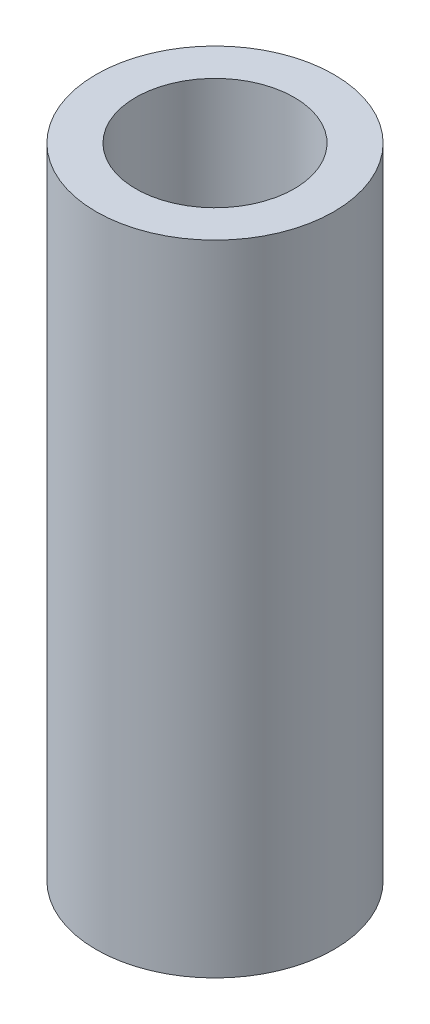
ISO-10303-21;
HEADER;
FILE_DESCRIPTION(('STEP AP214'),'2;1');
FILE_NAME('part.step','',(''),(''),'','','');
FILE_SCHEMA(('AUTOMOTIVE_DESIGN { 1 0 10303 214 1 1 1 1 }'));
ENDSEC;
DATA;
#1=APPLICATION_CONTEXT('core data for automotive mechanical design processes');
#2=APPLICATION_PROTOCOL_DEFINITION('international standard','automotive_design',2000,#1);
#3=PRODUCT_CONTEXT('',#1,'mechanical');
#4=PRODUCT('Part','Part','',(#3));
#5=PRODUCT_RELATED_PRODUCT_CATEGORY('part','',(#4));
#6=PRODUCT_DEFINITION_FORMATION('','',#4);
#7=PRODUCT_DEFINITION_CONTEXT('part definition',#1,'design');
#8=PRODUCT_DEFINITION('design','',#6,#7);
#9=PRODUCT_DEFINITION_SHAPE('','',#8);
#10=(LENGTH_UNIT() NAMED_UNIT(*) SI_UNIT(.MILLI.,.METRE.));
#11=(NAMED_UNIT(*) PLANE_ANGLE_UNIT() SI_UNIT($,.RADIAN.));
#12=(NAMED_UNIT(*) SI_UNIT($,.STERADIAN.) SOLID_ANGLE_UNIT());
#13=UNCERTAINTY_MEASURE_WITH_UNIT(LENGTH_MEASURE(1.E-05),#10,'distance_accuracy_value','');
#14=(GEOMETRIC_REPRESENTATION_CONTEXT(3) GLOBAL_UNCERTAINTY_ASSIGNED_CONTEXT((#13)) GLOBAL_UNIT_ASSIGNED_CONTEXT((#10,
#11,#12)) REPRESENTATION_CONTEXT('',''));
#15=CARTESIAN_POINT('',(0.,0.,0.));
#16=DIRECTION('',(0.,0.,1.));
#17=DIRECTION('',(1.,0.,0.));
#18=AXIS2_PLACEMENT_3D('',#15,#16,#17);
#19=CARTESIAN_POINT('',(0.,12.9,0.));
#20=DIRECTION('',(0.,1.,0.));
#21=DIRECTION('',(0.,0.,1.));
#22=AXIS2_PLACEMENT_3D('',#19,#20,#21);
#23=PLANE('',#22);
#24=CARTESIAN_POINT('',(0.,12.9,0.));
#25=DIRECTION('',(0.,1.,0.));
#26=DIRECTION('',(0.,0.,1.));
#27=AXIS2_PLACEMENT_3D('',#24,#25,#26);
#28=CIRCLE('',#27,2.4);
#29=CARTESIAN_POINT('',(0.,12.9,-2.4));
#30=VERTEX_POINT('',#29);
#31=EDGE_CURVE('E10',#30,#30,#28,.T.);
#32=ORIENTED_EDGE('',*,*,#31,.T.);
#33=EDGE_LOOP('',(#32));
#34=FACE_BOUND('',#33,.T.);
#35=CARTESIAN_POINT('',(0.,12.9,0.));
#36=DIRECTION('',(0.,1.,0.));
#37=DIRECTION('',(0.,0.,1.));
#38=AXIS2_PLACEMENT_3D('',#35,#36,#37);
#39=CIRCLE('',#38,1.6);
#40=CARTESIAN_POINT('',(0.,12.9,-1.6));
#41=VERTEX_POINT('',#40);
#42=EDGE_CURVE('E56',#41,#41,#39,.T.);
#43=ORIENTED_EDGE('',*,*,#42,.F.);
#44=EDGE_LOOP('',(#43));
#45=FACE_BOUND('',#44,.T.);
#46=ADVANCED_FACE('F43',(#34,#45),#23,.T.);
#47=CARTESIAN_POINT('',(0.,0.,0.));
#48=DIRECTION('',(0.,1.,0.));
#49=DIRECTION('',(0.,0.,1.));
#50=AXIS2_PLACEMENT_3D('',#47,#48,#49);
#51=PLANE('',#50);
#52=CARTESIAN_POINT('',(0.,0.,0.));
#53=DIRECTION('',(0.,1.,0.));
#54=DIRECTION('',(0.,0.,1.));
#55=AXIS2_PLACEMENT_3D('',#52,#53,#54);
#56=CIRCLE('',#55,2.4);
#57=CARTESIAN_POINT('',(0.,0.,-2.4));
#58=VERTEX_POINT('',#57);
#59=EDGE_CURVE('E47',#58,#58,#56,.T.);
#60=ORIENTED_EDGE('',*,*,#59,.F.);
#61=EDGE_LOOP('',(#60));
#62=FACE_BOUND('',#61,.T.);
#63=CARTESIAN_POINT('',(0.,0.,0.));
#64=DIRECTION('',(0.,1.,0.));
#65=DIRECTION('',(0.,0.,1.));
#66=AXIS2_PLACEMENT_3D('',#63,#64,#65);
#67=CIRCLE('',#66,1.6);
#68=CARTESIAN_POINT('',(0.,0.,-1.6));
#69=VERTEX_POINT('',#68);
#70=EDGE_CURVE('E58',#69,#69,#67,.T.);
#71=ORIENTED_EDGE('',*,*,#70,.T.);
#72=EDGE_LOOP('',(#71));
#73=FACE_BOUND('',#72,.T.);
#74=ADVANCED_FACE('F70',(#62,#73),#51,.F.);
#75=CARTESIAN_POINT('',(0.,12.9,0.));
#76=DIRECTION('',(0.,-1.,0.));
#77=DIRECTION('',(0.,0.,-1.));
#78=AXIS2_PLACEMENT_3D('',#75,#76,#77);
#79=CYLINDRICAL_SURFACE('',#78,2.4);
#80=CARTESIAN_POINT('',(0.,12.9,-2.4));
#81=CARTESIAN_POINT('',(0.,12.765625,-2.4));
#82=CARTESIAN_POINT('',(0.,12.63125,-2.4));
#83=CARTESIAN_POINT('',(0.,12.3625,-2.4));
#84=CARTESIAN_POINT('',(0.,12.228125,-2.4));
#85=CARTESIAN_POINT('',(0.,11.959375,-2.4));
#86=CARTESIAN_POINT('',(0.,11.825,-2.4));
#87=CARTESIAN_POINT('',(0.,11.55625,-2.4));
#88=CARTESIAN_POINT('',(0.,11.421875,-2.4));
#89=CARTESIAN_POINT('',(0.,11.153125,-2.4));
#90=CARTESIAN_POINT('',(0.,11.01875,-2.4));
#91=CARTESIAN_POINT('',(0.,10.75,-2.4));
#92=CARTESIAN_POINT('',(0.,10.615625,-2.4));
#93=CARTESIAN_POINT('',(0.,10.346875,-2.4));
#94=CARTESIAN_POINT('',(0.,10.2125,-2.4));
#95=CARTESIAN_POINT('',(0.,9.94375,-2.4));
#96=CARTESIAN_POINT('',(0.,9.809375,-2.4));
#97=CARTESIAN_POINT('',(0.,9.540625,-2.4));
#98=CARTESIAN_POINT('',(0.,9.40625,-2.4));
#99=CARTESIAN_POINT('',(0.,9.1375,-2.4));
#100=CARTESIAN_POINT('',(0.,9.003125,-2.4));
#101=CARTESIAN_POINT('',(0.,8.734375,-2.4));
#102=CARTESIAN_POINT('',(0.,8.6,-2.4));
#103=CARTESIAN_POINT('',(0.,8.33125,-2.4));
#104=CARTESIAN_POINT('',(0.,8.196875,-2.4));
#105=CARTESIAN_POINT('',(0.,7.928125,-2.4));
#106=CARTESIAN_POINT('',(0.,7.79375,-2.4));
#107=CARTESIAN_POINT('',(0.,7.525,-2.4));
#108=CARTESIAN_POINT('',(0.,7.390625,-2.4));
#109=CARTESIAN_POINT('',(0.,7.121875,-2.4));
#110=CARTESIAN_POINT('',(0.,6.9875,-2.4));
#111=CARTESIAN_POINT('',(0.,6.71875,-2.4));
#112=CARTESIAN_POINT('',(0.,6.584375,-2.4));
#113=CARTESIAN_POINT('',(0.,6.315625,-2.4));
#114=CARTESIAN_POINT('',(0.,6.18125,-2.4));
#115=CARTESIAN_POINT('',(0.,5.9125,-2.4));
#116=CARTESIAN_POINT('',(0.,5.778125,-2.4));
#117=CARTESIAN_POINT('',(0.,5.509375,-2.4));
#118=CARTESIAN_POINT('',(0.,5.375,-2.4));
#119=CARTESIAN_POINT('',(0.,5.10625,-2.4));
#120=CARTESIAN_POINT('',(0.,4.971875,-2.4));
#121=CARTESIAN_POINT('',(0.,4.703125,-2.4));
#122=CARTESIAN_POINT('',(0.,4.56875,-2.4));
#123=CARTESIAN_POINT('',(0.,4.3,-2.4));
#124=CARTESIAN_POINT('',(0.,4.165625,-2.4));
#125=CARTESIAN_POINT('',(0.,3.896875,-2.4));
#126=CARTESIAN_POINT('',(0.,3.7625,-2.4));
#127=CARTESIAN_POINT('',(0.,3.49375,-2.4));
#128=CARTESIAN_POINT('',(0.,3.359375,-2.4));
#129=CARTESIAN_POINT('',(0.,3.090625,-2.4));
#130=CARTESIAN_POINT('',(0.,2.95625,-2.4));
#131=CARTESIAN_POINT('',(0.,2.6875,-2.4));
#132=CARTESIAN_POINT('',(0.,2.553125,-2.4));
#133=CARTESIAN_POINT('',(0.,2.284375,-2.4));
#134=CARTESIAN_POINT('',(0.,2.15,-2.4));
#135=CARTESIAN_POINT('',(0.,1.88125,-2.4));
#136=CARTESIAN_POINT('',(0.,1.746875,-2.4));
#137=CARTESIAN_POINT('',(0.,1.478125,-2.4));
#138=CARTESIAN_POINT('',(0.,1.34375,-2.4));
#139=CARTESIAN_POINT('',(0.,1.075,-2.4));
#140=CARTESIAN_POINT('',(0.,0.940625,-2.4));
#141=CARTESIAN_POINT('',(0.,0.671875,-2.4));
#142=CARTESIAN_POINT('',(0.,0.5375,-2.4));
#143=CARTESIAN_POINT('',(0.,0.268750000000001,-2.4));
#144=CARTESIAN_POINT('',(0.,0.134375,-2.4));
#145=CARTESIAN_POINT('',(0.,0.,-2.4));
#146=B_SPLINE_CURVE_WITH_KNOTS('',3,(#80,#81,#82,#83,#84,#85,#86,#87,#88,#89,#90,#91,#92,#93,
#94,#95,#96,#97,#98,#99,#100,#101,#102,#103,#104,#105,#106,#107,#108,#109,#110,#111,#112,#113,
#114,#115,#116,#117,#118,#119,#120,#121,#122,#123,#124,#125,#126,#127,#128,#129,#130,#131,#132,
#133,#134,#135,#136,#137,#138,#139,#140,#141,#142,#143,#144,#145),.UNSPECIFIED.,.F.,.F.,(4,2,2,
2,2,2,2,2,2,2,2,2,2,2,2,2,2,2,2,2,2,2,2,2,2,2,2,2,2,2,2,2,4),(0.,0.403125000000001,
0.806250000000001,1.209375,1.6125,2.015625,2.41875,2.821875,3.225,3.628125,4.03125,4.434375,
4.8375,5.240625,5.64375,6.046875,6.45,6.853125,7.25625,7.659375,8.0625,8.465625,8.86875,
9.271875,9.675,10.078125,10.48125,10.884375,11.2875,11.690625,12.09375,12.496875,12.9),.UNSPECIFIED.);
#147=EDGE_CURVE('BSEAM45',#30,#58,#146,.T.);
#148=ORIENTED_EDGE('',*,*,#31,.F.);
#149=ORIENTED_EDGE('',*,*,#59,.T.);
#150=ORIENTED_EDGE('',*,*,#147,.T.);
#151=ORIENTED_EDGE('',*,*,#147,.F.);
#152=EDGE_LOOP('',(#148,#150,#149,#151));
#153=FACE_BOUND('',#152,.T.);
#154=ADVANCED_FACE('F45',(#153),#79,.T.);
#155=CARTESIAN_POINT('',(0.,12.9,0.));
#156=DIRECTION('',(0.,-1.,0.));
#157=DIRECTION('',(0.,0.,-1.));
#158=AXIS2_PLACEMENT_3D('',#155,#156,#157);
#159=CYLINDRICAL_SURFACE('',#158,1.6);
#160=CARTESIAN_POINT('',(0.,12.9,-1.6));
#161=CARTESIAN_POINT('',(0.,12.765625,-1.6));
#162=CARTESIAN_POINT('',(0.,12.63125,-1.6));
#163=CARTESIAN_POINT('',(0.,12.3625,-1.6));
#164=CARTESIAN_POINT('',(0.,12.228125,-1.6));
#165=CARTESIAN_POINT('',(0.,11.959375,-1.6));
#166=CARTESIAN_POINT('',(0.,11.825,-1.6));
#167=CARTESIAN_POINT('',(0.,11.55625,-1.6));
#168=CARTESIAN_POINT('',(0.,11.421875,-1.6));
#169=CARTESIAN_POINT('',(0.,11.153125,-1.6));
#170=CARTESIAN_POINT('',(0.,11.01875,-1.6));
#171=CARTESIAN_POINT('',(0.,10.75,-1.6));
#172=CARTESIAN_POINT('',(0.,10.615625,-1.6));
#173=CARTESIAN_POINT('',(0.,10.346875,-1.6));
#174=CARTESIAN_POINT('',(0.,10.2125,-1.6));
#175=CARTESIAN_POINT('',(0.,9.94375,-1.6));
#176=CARTESIAN_POINT('',(0.,9.809375,-1.6));
#177=CARTESIAN_POINT('',(0.,9.540625,-1.6));
#178=CARTESIAN_POINT('',(0.,9.40625,-1.6));
#179=CARTESIAN_POINT('',(0.,9.1375,-1.6));
#180=CARTESIAN_POINT('',(0.,9.003125,-1.6));
#181=CARTESIAN_POINT('',(0.,8.734375,-1.6));
#182=CARTESIAN_POINT('',(0.,8.6,-1.6));
#183=CARTESIAN_POINT('',(0.,8.33125,-1.6));
#184=CARTESIAN_POINT('',(0.,8.196875,-1.6));
#185=CARTESIAN_POINT('',(0.,7.928125,-1.6));
#186=CARTESIAN_POINT('',(0.,7.79375,-1.6));
#187=CARTESIAN_POINT('',(0.,7.525,-1.6));
#188=CARTESIAN_POINT('',(0.,7.390625,-1.6));
#189=CARTESIAN_POINT('',(0.,7.121875,-1.6));
#190=CARTESIAN_POINT('',(0.,6.9875,-1.6));
#191=CARTESIAN_POINT('',(0.,6.71875,-1.6));
#192=CARTESIAN_POINT('',(0.,6.584375,-1.6));
#193=CARTESIAN_POINT('',(0.,6.315625,-1.6));
#194=CARTESIAN_POINT('',(0.,6.18125,-1.6));
#195=CARTESIAN_POINT('',(0.,5.9125,-1.6));
#196=CARTESIAN_POINT('',(0.,5.778125,-1.6));
#197=CARTESIAN_POINT('',(0.,5.509375,-1.6));
#198=CARTESIAN_POINT('',(0.,5.375,-1.6));
#199=CARTESIAN_POINT('',(0.,5.10625,-1.6));
#200=CARTESIAN_POINT('',(0.,4.971875,-1.6));
#201=CARTESIAN_POINT('',(0.,4.703125,-1.6));
#202=CARTESIAN_POINT('',(0.,4.56875,-1.6));
#203=CARTESIAN_POINT('',(0.,4.3,-1.6));
#204=CARTESIAN_POINT('',(0.,4.165625,-1.6));
#205=CARTESIAN_POINT('',(0.,3.896875,-1.6));
#206=CARTESIAN_POINT('',(0.,3.7625,-1.6));
#207=CARTESIAN_POINT('',(0.,3.49375,-1.6));
#208=CARTESIAN_POINT('',(0.,3.359375,-1.6));
#209=CARTESIAN_POINT('',(0.,3.090625,-1.6));
#210=CARTESIAN_POINT('',(0.,2.95625,-1.6));
#211=CARTESIAN_POINT('',(0.,2.6875,-1.6));
#212=CARTESIAN_POINT('',(0.,2.553125,-1.6));
#213=CARTESIAN_POINT('',(0.,2.284375,-1.6));
#214=CARTESIAN_POINT('',(0.,2.15,-1.6));
#215=CARTESIAN_POINT('',(0.,1.88125,-1.6));
#216=CARTESIAN_POINT('',(0.,1.746875,-1.6));
#217=CARTESIAN_POINT('',(0.,1.478125,-1.6));
#218=CARTESIAN_POINT('',(0.,1.34375,-1.6));
#219=CARTESIAN_POINT('',(0.,1.075,-1.6));
#220=CARTESIAN_POINT('',(0.,0.940625,-1.6));
#221=CARTESIAN_POINT('',(0.,0.671875,-1.6));
#222=CARTESIAN_POINT('',(0.,0.5375,-1.6));
#223=CARTESIAN_POINT('',(0.,0.268750000000001,-1.6));
#224=CARTESIAN_POINT('',(0.,0.134375,-1.6));
#225=CARTESIAN_POINT('',(0.,0.,-1.6));
#226=B_SPLINE_CURVE_WITH_KNOTS('',3,(#160,#161,#162,#163,#164,#165,#166,#167,#168,#169,#170,
#171,#172,#173,#174,#175,#176,#177,#178,#179,#180,#181,#182,#183,#184,#185,#186,#187,#188,#189,
#190,#191,#192,#193,#194,#195,#196,#197,#198,#199,#200,#201,#202,#203,#204,#205,#206,#207,#208,
#209,#210,#211,#212,#213,#214,#215,#216,#217,#218,#219,#220,#221,#222,#223,#224,#225),
.UNSPECIFIED.,.F.,.F.,(4,2,2,2,2,2,2,2,2,2,2,2,2,2,2,2,2,2,2,2,2,2,2,2,2,2,2,2,2,2,2,2,4),(0.,
0.403125000000001,0.806250000000001,1.209375,1.6125,2.015625,2.41875,2.821875,3.225,3.628125,
4.03125,4.434375,4.8375,5.240625,5.64375,6.046875,6.45,6.853125,7.25625,7.659375,8.0625,
8.465625,8.86875,9.271875,9.675,10.078125,10.48125,10.884375,11.2875,11.690625,12.09375,
12.496875,12.9),.UNSPECIFIED.);
#227=EDGE_CURVE('BSEAM66',#41,#69,#226,.T.);
#228=ORIENTED_EDGE('',*,*,#42,.T.);
#229=ORIENTED_EDGE('',*,*,#70,.F.);
#230=ORIENTED_EDGE('',*,*,#227,.T.);
#231=ORIENTED_EDGE('',*,*,#227,.F.);
#232=EDGE_LOOP('',(#228,#230,#229,#231));
#233=FACE_BOUND('',#232,.T.);
#234=ADVANCED_FACE('F66',(#233),#159,.F.);
#235=CLOSED_SHELL('',(#46,#74,#154,#234));
#236=MANIFOLD_SOLID_BREP('B2',#235);
#237=ADVANCED_BREP_SHAPE_REPRESENTATION('',(#18,#236),#14);
#238=SHAPE_DEFINITION_REPRESENTATION(#9,#237);
ENDSEC;
END-ISO-10303-21;
